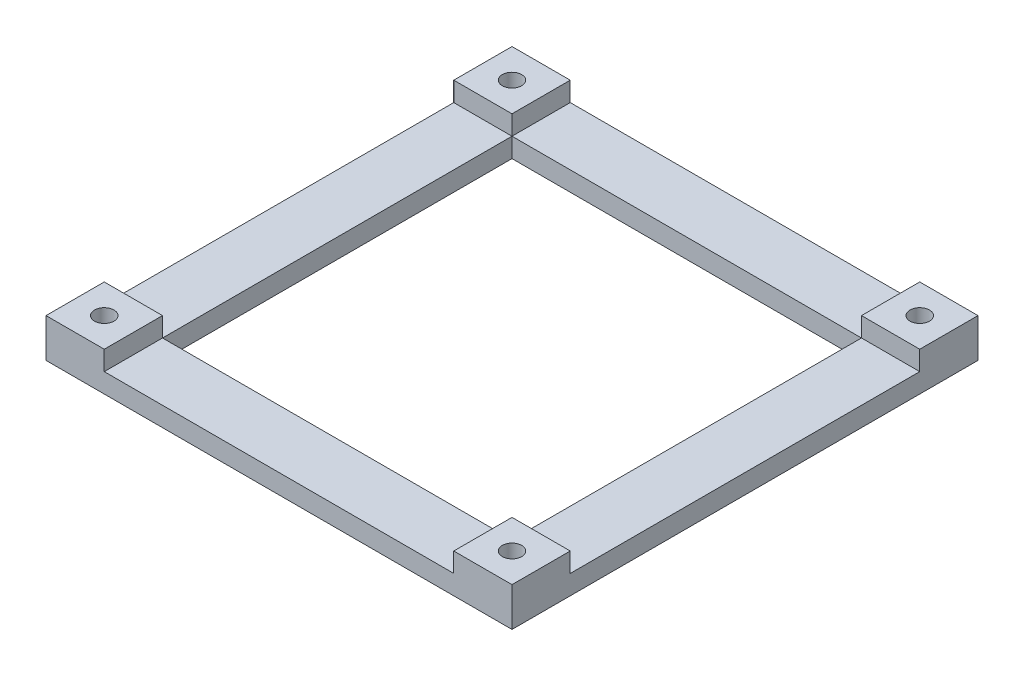
ISO-10303-21;
HEADER;
FILE_DESCRIPTION(('STEP AP214'),'2;1');
FILE_NAME('part.step','',(''),(''),'','','');
FILE_SCHEMA(('AUTOMOTIVE_DESIGN { 1 0 10303 214 1 1 1 1 }'));
ENDSEC;
DATA;
#1=APPLICATION_CONTEXT('core data for automotive mechanical design processes');
#2=APPLICATION_PROTOCOL_DEFINITION('international standard','automotive_design',2000,#1);
#3=PRODUCT_CONTEXT('',#1,'mechanical');
#4=PRODUCT('Part','Part','',(#3));
#5=PRODUCT_RELATED_PRODUCT_CATEGORY('part','',(#4));
#6=PRODUCT_DEFINITION_FORMATION('','',#4);
#7=PRODUCT_DEFINITION_CONTEXT('part definition',#1,'design');
#8=PRODUCT_DEFINITION('design','',#6,#7);
#9=PRODUCT_DEFINITION_SHAPE('','',#8);
#10=(LENGTH_UNIT() NAMED_UNIT(*) SI_UNIT(.MILLI.,.METRE.));
#11=(NAMED_UNIT(*) PLANE_ANGLE_UNIT() SI_UNIT($,.RADIAN.));
#12=(NAMED_UNIT(*) SI_UNIT($,.STERADIAN.) SOLID_ANGLE_UNIT());
#13=UNCERTAINTY_MEASURE_WITH_UNIT(LENGTH_MEASURE(1.E-05),#10,'distance_accuracy_value','');
#14=(GEOMETRIC_REPRESENTATION_CONTEXT(3) GLOBAL_UNCERTAINTY_ASSIGNED_CONTEXT((#13)) GLOBAL_UNIT_ASSIGNED_CONTEXT((#10,
#11,#12)) REPRESENTATION_CONTEXT('',''));
#15=CARTESIAN_POINT('',(0.,0.,0.));
#16=DIRECTION('',(0.,0.,1.));
#17=DIRECTION('',(1.,0.,0.));
#18=AXIS2_PLACEMENT_3D('',#15,#16,#17);
#19=CARTESIAN_POINT('',(0.,5.,0.));
#20=DIRECTION('',(0.,-1.,0.));
#21=DIRECTION('',(0.,0.,-1.));
#22=AXIS2_PLACEMENT_3D('',#19,#20,#21);
#23=PLANE('',#22);
#24=DIRECTION('',(-1.,0.,0.));
#25=VECTOR('',#24,1.);
#26=CARTESIAN_POINT('',(-45.,5.,45.));
#27=LINE('',#26,#25);
#28=CARTESIAN_POINT('',(-45.,5.,45.));
#29=VERTEX_POINT('',#28);
#30=CARTESIAN_POINT('',(-60.,5.,45.));
#31=VERTEX_POINT('',#30);
#32=EDGE_CURVE('E258',#29,#31,#27,.T.);
#33=ORIENTED_EDGE('',*,*,#32,.F.);
#34=DIRECTION('',(0.,0.,1.));
#35=VECTOR('',#34,1.);
#36=CARTESIAN_POINT('',(-45.,5.,45.));
#37=LINE('',#36,#35);
#38=CARTESIAN_POINT('',(-45.,5.,-45.));
#39=VERTEX_POINT('',#38);
#40=EDGE_CURVE('E348',#39,#29,#37,.T.);
#41=ORIENTED_EDGE('',*,*,#40,.F.);
#42=DIRECTION('',(1.,0.,0.));
#43=VECTOR('',#42,1.);
#44=CARTESIAN_POINT('',(-45.,5.,-45.));
#45=LINE('',#44,#43);
#46=CARTESIAN_POINT('',(-60.,5.,-45.));
#47=VERTEX_POINT('',#46);
#48=EDGE_CURVE('E323',#47,#39,#45,.T.);
#49=ORIENTED_EDGE('',*,*,#48,.F.);
#50=DIRECTION('',(0.,0.,1.));
#51=VECTOR('',#50,1.);
#52=CARTESIAN_POINT('',(-60.,5.,60.));
#53=LINE('',#52,#51);
#54=EDGE_CURVE('E382',#47,#31,#53,.T.);
#55=ORIENTED_EDGE('',*,*,#54,.T.);
#56=EDGE_LOOP('',(#33,#41,#49,#55));
#57=FACE_BOUND('',#56,.T.);
#58=ADVANCED_FACE('F50',(#57),#23,.F.);
#59=DIRECTION('',(0.,0.,-1.));
#60=VECTOR('',#59,1.);
#61=CARTESIAN_POINT('',(-45.,5.,45.));
#62=LINE('',#61,#60);
#63=CARTESIAN_POINT('',(-45.,5.,60.));
#64=VERTEX_POINT('',#63);
#65=EDGE_CURVE('E66',#64,#29,#62,.T.);
#66=ORIENTED_EDGE('',*,*,#65,.F.);
#67=DIRECTION('',(1.,0.,0.));
#68=VECTOR('',#67,1.);
#69=CARTESIAN_POINT('',(-60.,5.,60.));
#70=LINE('',#69,#68);
#71=CARTESIAN_POINT('',(45.,5.,60.));
#72=VERTEX_POINT('',#71);
#73=EDGE_CURVE('E64',#64,#72,#70,.T.);
#74=ORIENTED_EDGE('',*,*,#73,.T.);
#75=DIRECTION('',(0.,0.,1.));
#76=VECTOR('',#75,1.);
#77=CARTESIAN_POINT('',(45.,5.,45.));
#78=LINE('',#77,#76);
#79=CARTESIAN_POINT('',(45.,5.,45.));
#80=VERTEX_POINT('',#79);
#81=EDGE_CURVE('E267',#80,#72,#78,.T.);
#82=ORIENTED_EDGE('',*,*,#81,.F.);
#83=DIRECTION('',(1.,0.,0.));
#84=VECTOR('',#83,1.);
#85=CARTESIAN_POINT('',(-45.,5.,45.));
#86=LINE('',#85,#84);
#87=EDGE_CURVE('E200',#29,#80,#86,.T.);
#88=ORIENTED_EDGE('',*,*,#87,.F.);
#89=EDGE_LOOP('',(#66,#74,#82,#88));
#90=FACE_BOUND('',#89,.T.);
#91=ADVANCED_FACE('F433',(#90),#23,.F.);
#92=DIRECTION('',(-1.,0.,0.));
#93=VECTOR('',#92,1.);
#94=CARTESIAN_POINT('',(45.,5.,45.));
#95=LINE('',#94,#93);
#96=CARTESIAN_POINT('',(60.,5.,45.));
#97=VERTEX_POINT('',#96);
#98=EDGE_CURVE('E264',#97,#80,#95,.T.);
#99=ORIENTED_EDGE('',*,*,#98,.F.);
#100=DIRECTION('',(0.,0.,-1.));
#101=VECTOR('',#100,1.);
#102=CARTESIAN_POINT('',(60.,5.,60.));
#103=LINE('',#102,#101);
#104=CARTESIAN_POINT('',(60.,5.,-45.));
#105=VERTEX_POINT('',#104);
#106=EDGE_CURVE('E211',#97,#105,#103,.T.);
#107=ORIENTED_EDGE('',*,*,#106,.T.);
#108=DIRECTION('',(1.,0.,0.));
#109=VECTOR('',#108,1.);
#110=CARTESIAN_POINT('',(45.,5.,-45.));
#111=LINE('',#110,#109);
#112=CARTESIAN_POINT('',(45.,5.,-45.));
#113=VERTEX_POINT('',#112);
#114=EDGE_CURVE('E208',#113,#105,#111,.T.);
#115=ORIENTED_EDGE('',*,*,#114,.F.);
#116=DIRECTION('',(0.,0.,-1.));
#117=VECTOR('',#116,1.);
#118=CARTESIAN_POINT('',(45.,5.,45.));
#119=LINE('',#118,#117);
#120=EDGE_CURVE('E187',#80,#113,#119,.T.);
#121=ORIENTED_EDGE('',*,*,#120,.F.);
#122=EDGE_LOOP('',(#99,#107,#115,#121));
#123=FACE_BOUND('',#122,.T.);
#124=ADVANCED_FACE('F207',(#123),#23,.F.);
#125=DIRECTION('',(0.,0.,1.));
#126=VECTOR('',#125,1.);
#127=CARTESIAN_POINT('',(45.,5.,-45.));
#128=LINE('',#127,#126);
#129=CARTESIAN_POINT('',(45.,5.,-60.));
#130=VERTEX_POINT('',#129);
#131=EDGE_CURVE('E178',#130,#113,#128,.T.);
#132=ORIENTED_EDGE('',*,*,#131,.F.);
#133=DIRECTION('',(-1.,0.,0.));
#134=VECTOR('',#133,1.);
#135=CARTESIAN_POINT('',(-60.,5.,-60.));
#136=LINE('',#135,#134);
#137=CARTESIAN_POINT('',(-45.,5.,-60.));
#138=VERTEX_POINT('',#137);
#139=EDGE_CURVE('E377',#130,#138,#136,.T.);
#140=ORIENTED_EDGE('',*,*,#139,.T.);
#141=DIRECTION('',(0.,0.,-1.));
#142=VECTOR('',#141,1.);
#143=CARTESIAN_POINT('',(-45.,5.,-45.));
#144=LINE('',#143,#142);
#145=EDGE_CURVE('E177',#39,#138,#144,.T.);
#146=ORIENTED_EDGE('',*,*,#145,.F.);
#147=DIRECTION('',(-1.,0.,0.));
#148=VECTOR('',#147,1.);
#149=CARTESIAN_POINT('',(-45.,5.,-45.));
#150=LINE('',#149,#148);
#151=EDGE_CURVE('E175',#113,#39,#150,.T.);
#152=ORIENTED_EDGE('',*,*,#151,.F.);
#153=EDGE_LOOP('',(#132,#140,#146,#152));
#154=FACE_BOUND('',#153,.T.);
#155=ADVANCED_FACE('F171',(#154),#23,.F.);
#156=CARTESIAN_POINT('',(0.,0.,0.));
#157=DIRECTION('',(0.,-1.,0.));
#158=DIRECTION('',(0.,0.,-1.));
#159=AXIS2_PLACEMENT_3D('',#156,#157,#158);
#160=PLANE('',#159);
#161=CARTESIAN_POINT('',(52.4999999999995,0.,52.5000000000005));
#162=DIRECTION('',(0.,1.,0.));
#163=DIRECTION('',(0.,0.,1.));
#164=AXIS2_PLACEMENT_3D('',#161,#162,#163);
#165=CIRCLE('',#164,2.5);
#166=CARTESIAN_POINT('',(52.4999999999995,0.,55.0000000000005));
#167=VERTEX_POINT('',#166);
#168=EDGE_CURVE('E450',#167,#167,#165,.T.);
#169=ORIENTED_EDGE('',*,*,#168,.T.);
#170=EDGE_LOOP('',(#169));
#171=FACE_BOUND('',#170,.T.);
#172=CARTESIAN_POINT('',(52.5000000000004,0.,-52.4999999999996));
#173=DIRECTION('',(0.,1.,0.));
#174=DIRECTION('',(0.,0.,1.));
#175=AXIS2_PLACEMENT_3D('',#172,#173,#174);
#176=CIRCLE('',#175,2.5);
#177=CARTESIAN_POINT('',(52.5000000000004,0.,-49.9999999999996));
#178=VERTEX_POINT('',#177);
#179=EDGE_CURVE('E454',#178,#178,#176,.T.);
#180=ORIENTED_EDGE('',*,*,#179,.T.);
#181=EDGE_LOOP('',(#180));
#182=FACE_BOUND('',#181,.T.);
#183=CARTESIAN_POINT('',(-52.4999999999998,0.,-52.5000000000002));
#184=DIRECTION('',(0.,1.,0.));
#185=DIRECTION('',(0.,0.,1.));
#186=AXIS2_PLACEMENT_3D('',#183,#184,#185);
#187=CIRCLE('',#186,2.5);
#188=CARTESIAN_POINT('',(-52.4999999999998,0.,-50.0000000000002));
#189=VERTEX_POINT('',#188);
#190=EDGE_CURVE('E464',#189,#189,#187,.T.);
#191=ORIENTED_EDGE('',*,*,#190,.T.);
#192=EDGE_LOOP('',(#191));
#193=FACE_BOUND('',#192,.T.);
#194=CARTESIAN_POINT('',(-52.5,0.,52.5));
#195=DIRECTION('',(0.,1.,0.));
#196=DIRECTION('',(0.,0.,1.));
#197=AXIS2_PLACEMENT_3D('',#194,#195,#196);
#198=CIRCLE('',#197,2.5);
#199=CARTESIAN_POINT('',(-52.5,0.,55.));
#200=VERTEX_POINT('',#199);
#201=EDGE_CURVE('E292',#200,#200,#198,.T.);
#202=ORIENTED_EDGE('',*,*,#201,.T.);
#203=EDGE_LOOP('',(#202));
#204=FACE_BOUND('',#203,.T.);
#205=DIRECTION('',(0.,0.,-1.));
#206=VECTOR('',#205,1.);
#207=CARTESIAN_POINT('',(60.,0.,60.));
#208=LINE('',#207,#206);
#209=CARTESIAN_POINT('',(60.,0.,60.));
#210=VERTEX_POINT('',#209);
#211=CARTESIAN_POINT('',(60.,0.,-60.));
#212=VERTEX_POINT('',#211);
#213=EDGE_CURVE('E376',#210,#212,#208,.T.);
#214=ORIENTED_EDGE('',*,*,#213,.F.);
#215=DIRECTION('',(1.,0.,0.));
#216=VECTOR('',#215,1.);
#217=CARTESIAN_POINT('',(-60.,0.,60.));
#218=LINE('',#217,#216);
#219=CARTESIAN_POINT('',(-60.,0.,60.));
#220=VERTEX_POINT('',#219);
#221=EDGE_CURVE('E379',#220,#210,#218,.T.);
#222=ORIENTED_EDGE('',*,*,#221,.F.);
#223=DIRECTION('',(0.,0.,1.));
#224=VECTOR('',#223,1.);
#225=CARTESIAN_POINT('',(-60.,0.,60.));
#226=LINE('',#225,#224);
#227=CARTESIAN_POINT('',(-60.,0.,-60.));
#228=VERTEX_POINT('',#227);
#229=EDGE_CURVE('E391',#228,#220,#226,.T.);
#230=ORIENTED_EDGE('',*,*,#229,.F.);
#231=DIRECTION('',(-1.,0.,0.));
#232=VECTOR('',#231,1.);
#233=CARTESIAN_POINT('',(-60.,0.,-60.));
#234=LINE('',#233,#232);
#235=EDGE_CURVE('E392',#212,#228,#234,.T.);
#236=ORIENTED_EDGE('',*,*,#235,.F.);
#237=EDGE_LOOP('',(#214,#222,#230,#236));
#238=FACE_BOUND('',#237,.T.);
#239=DIRECTION('',(-1.,0.,0.));
#240=VECTOR('',#239,1.);
#241=CARTESIAN_POINT('',(-45.,0.,-45.));
#242=LINE('',#241,#240);
#243=CARTESIAN_POINT('',(45.,0.,-45.));
#244=VERTEX_POINT('',#243);
#245=CARTESIAN_POINT('',(-45.,0.,-45.));
#246=VERTEX_POINT('',#245);
#247=EDGE_CURVE('E201',#244,#246,#242,.T.);
#248=ORIENTED_EDGE('',*,*,#247,.T.);
#249=DIRECTION('',(0.,0.,1.));
#250=VECTOR('',#249,1.);
#251=CARTESIAN_POINT('',(-45.,0.,45.));
#252=LINE('',#251,#250);
#253=CARTESIAN_POINT('',(-45.,0.,45.));
#254=VERTEX_POINT('',#253);
#255=EDGE_CURVE('E349',#246,#254,#252,.T.);
#256=ORIENTED_EDGE('',*,*,#255,.T.);
#257=DIRECTION('',(1.,0.,0.));
#258=VECTOR('',#257,1.);
#259=CARTESIAN_POINT('',(-45.,0.,45.));
#260=LINE('',#259,#258);
#261=CARTESIAN_POINT('',(45.,0.,45.));
#262=VERTEX_POINT('',#261);
#263=EDGE_CURVE('E356',#254,#262,#260,.T.);
#264=ORIENTED_EDGE('',*,*,#263,.T.);
#265=DIRECTION('',(0.,0.,-1.));
#266=VECTOR('',#265,1.);
#267=CARTESIAN_POINT('',(45.,0.,45.));
#268=LINE('',#267,#266);
#269=EDGE_CURVE('E361',#262,#244,#268,.T.);
#270=ORIENTED_EDGE('',*,*,#269,.T.);
#271=EDGE_LOOP('',(#248,#256,#264,#270));
#272=FACE_BOUND('',#271,.T.);
#273=ADVANCED_FACE('F418',(#171,#182,#193,#204,#238,#272),#160,.T.);
#274=CARTESIAN_POINT('',(60.,5.,60.));
#275=DIRECTION('',(-1.,0.,0.));
#276=DIRECTION('',(0.,0.,1.));
#277=AXIS2_PLACEMENT_3D('',#274,#275,#276);
#278=PLANE('',#277);
#279=ORIENTED_EDGE('',*,*,#213,.T.);
#280=DIRECTION('',(0.,-1.,0.));
#281=VECTOR('',#280,1.);
#282=CARTESIAN_POINT('',(60.,5.,-60.));
#283=LINE('',#282,#281);
#284=CARTESIAN_POINT('',(60.,10.,-60.));
#285=VERTEX_POINT('',#284);
#286=EDGE_CURVE('E11',#285,#212,#283,.T.);
#287=ORIENTED_EDGE('',*,*,#286,.F.);
#288=DIRECTION('',(0.,0.,-1.));
#289=VECTOR('',#288,1.);
#290=CARTESIAN_POINT('',(60.,10.,-45.));
#291=LINE('',#290,#289);
#292=CARTESIAN_POINT('',(60.,10.,-45.));
#293=VERTEX_POINT('',#292);
#294=EDGE_CURVE('E247',#293,#285,#291,.T.);
#295=ORIENTED_EDGE('',*,*,#294,.F.);
#296=DIRECTION('',(0.,-1.,0.));
#297=VECTOR('',#296,1.);
#298=CARTESIAN_POINT('',(60.,10.,-45.));
#299=LINE('',#298,#297);
#300=EDGE_CURVE('E238',#293,#105,#299,.T.);
#301=ORIENTED_EDGE('',*,*,#300,.T.);
#302=ORIENTED_EDGE('',*,*,#106,.F.);
#303=DIRECTION('',(0.,-1.,0.));
#304=VECTOR('',#303,1.);
#305=CARTESIAN_POINT('',(60.,10.,45.));
#306=LINE('',#305,#304);
#307=CARTESIAN_POINT('',(60.,10.,45.));
#308=VERTEX_POINT('',#307);
#309=EDGE_CURVE('E254',#308,#97,#306,.T.);
#310=ORIENTED_EDGE('',*,*,#309,.F.);
#311=DIRECTION('',(0.,0.,-1.));
#312=VECTOR('',#311,1.);
#313=CARTESIAN_POINT('',(60.,10.,45.));
#314=LINE('',#313,#312);
#315=CARTESIAN_POINT('',(60.,10.,60.));
#316=VERTEX_POINT('',#315);
#317=EDGE_CURVE('E277',#316,#308,#314,.T.);
#318=ORIENTED_EDGE('',*,*,#317,.F.);
#319=DIRECTION('',(0.,-1.,0.));
#320=VECTOR('',#319,1.);
#321=CARTESIAN_POINT('',(60.,5.,60.));
#322=LINE('',#321,#320);
#323=EDGE_CURVE('E390',#316,#210,#322,.T.);
#324=ORIENTED_EDGE('',*,*,#323,.T.);
#325=EDGE_LOOP('',(#279,#287,#295,#301,#302,#310,#318,#324));
#326=FACE_BOUND('',#325,.T.);
#327=ADVANCED_FACE('F47',(#326),#278,.F.);
#328=CARTESIAN_POINT('',(-60.,5.,-60.));
#329=DIRECTION('',(0.,0.,1.));
#330=DIRECTION('',(1.,0.,0.));
#331=AXIS2_PLACEMENT_3D('',#328,#329,#330);
#332=PLANE('',#331);
#333=ORIENTED_EDGE('',*,*,#235,.T.);
#334=DIRECTION('',(0.,-1.,0.));
#335=VECTOR('',#334,1.);
#336=CARTESIAN_POINT('',(-60.,5.,-60.));
#337=LINE('',#336,#335);
#338=CARTESIAN_POINT('',(-60.,10.,-60.));
#339=VERTEX_POINT('',#338);
#340=EDGE_CURVE('E57',#339,#228,#337,.T.);
#341=ORIENTED_EDGE('',*,*,#340,.F.);
#342=DIRECTION('',(-1.,0.,0.));
#343=VECTOR('',#342,1.);
#344=CARTESIAN_POINT('',(-45.,10.,-60.));
#345=LINE('',#344,#343);
#346=CARTESIAN_POINT('',(-45.,10.,-60.));
#347=VERTEX_POINT('',#346);
#348=EDGE_CURVE('E325',#347,#339,#345,.T.);
#349=ORIENTED_EDGE('',*,*,#348,.F.);
#350=DIRECTION('',(0.,-1.,0.));
#351=VECTOR('',#350,1.);
#352=CARTESIAN_POINT('',(-45.,10.,-60.));
#353=LINE('',#352,#351);
#354=EDGE_CURVE('E344',#347,#138,#353,.T.);
#355=ORIENTED_EDGE('',*,*,#354,.T.);
#356=ORIENTED_EDGE('',*,*,#139,.F.);
#357=DIRECTION('',(0.,-1.,0.));
#358=VECTOR('',#357,1.);
#359=CARTESIAN_POINT('',(45.,10.,-60.));
#360=LINE('',#359,#358);
#361=CARTESIAN_POINT('',(45.,10.,-60.));
#362=VERTEX_POINT('',#361);
#363=EDGE_CURVE('E227',#362,#130,#360,.T.);
#364=ORIENTED_EDGE('',*,*,#363,.F.);
#365=DIRECTION('',(-1.,0.,0.));
#366=VECTOR('',#365,1.);
#367=CARTESIAN_POINT('',(45.,10.,-60.));
#368=LINE('',#367,#366);
#369=EDGE_CURVE('E240',#285,#362,#368,.T.);
#370=ORIENTED_EDGE('',*,*,#369,.F.);
#371=ORIENTED_EDGE('',*,*,#286,.T.);
#372=EDGE_LOOP('',(#333,#341,#349,#355,#356,#364,#370,#371));
#373=FACE_BOUND('',#372,.T.);
#374=ADVANCED_FACE('F482',(#373),#332,.F.);
#375=CARTESIAN_POINT('',(-60.,5.,60.));
#376=DIRECTION('',(1.,0.,0.));
#377=DIRECTION('',(0.,0.,-1.));
#378=AXIS2_PLACEMENT_3D('',#375,#376,#377);
#379=PLANE('',#378);
#380=ORIENTED_EDGE('',*,*,#229,.T.);
#381=DIRECTION('',(0.,-1.,0.));
#382=VECTOR('',#381,1.);
#383=CARTESIAN_POINT('',(-60.,5.,60.));
#384=LINE('',#383,#382);
#385=CARTESIAN_POINT('',(-60.,10.,60.));
#386=VERTEX_POINT('',#385);
#387=EDGE_CURVE('E405',#386,#220,#384,.T.);
#388=ORIENTED_EDGE('',*,*,#387,.F.);
#389=DIRECTION('',(0.,0.,1.));
#390=VECTOR('',#389,1.);
#391=CARTESIAN_POINT('',(-60.,10.,45.));
#392=LINE('',#391,#390);
#393=CARTESIAN_POINT('',(-60.,10.,45.));
#394=VERTEX_POINT('',#393);
#395=EDGE_CURVE('E313',#394,#386,#392,.T.);
#396=ORIENTED_EDGE('',*,*,#395,.F.);
#397=DIRECTION('',(0.,-1.,0.));
#398=VECTOR('',#397,1.);
#399=CARTESIAN_POINT('',(-60.,10.,45.));
#400=LINE('',#399,#398);
#401=EDGE_CURVE('E288',#394,#31,#400,.T.);
#402=ORIENTED_EDGE('',*,*,#401,.T.);
#403=ORIENTED_EDGE('',*,*,#54,.F.);
#404=DIRECTION('',(0.,-1.,0.));
#405=VECTOR('',#404,1.);
#406=CARTESIAN_POINT('',(-60.,10.,-45.));
#407=LINE('',#406,#405);
#408=CARTESIAN_POINT('',(-60.,10.,-45.));
#409=VERTEX_POINT('',#408);
#410=EDGE_CURVE('E343',#409,#47,#407,.T.);
#411=ORIENTED_EDGE('',*,*,#410,.F.);
#412=DIRECTION('',(0.,0.,1.));
#413=VECTOR('',#412,1.);
#414=CARTESIAN_POINT('',(-60.,10.,-45.));
#415=LINE('',#414,#413);
#416=EDGE_CURVE('E330',#339,#409,#415,.T.);
#417=ORIENTED_EDGE('',*,*,#416,.F.);
#418=ORIENTED_EDGE('',*,*,#340,.T.);
#419=EDGE_LOOP('',(#380,#388,#396,#402,#403,#411,#417,#418));
#420=FACE_BOUND('',#419,.T.);
#421=ADVANCED_FACE('F408',(#420),#379,.F.);
#422=CARTESIAN_POINT('',(-60.,5.,60.));
#423=DIRECTION('',(0.,0.,-1.));
#424=DIRECTION('',(-1.,0.,0.));
#425=AXIS2_PLACEMENT_3D('',#422,#423,#424);
#426=PLANE('',#425);
#427=ORIENTED_EDGE('',*,*,#221,.T.);
#428=ORIENTED_EDGE('',*,*,#323,.F.);
#429=DIRECTION('',(1.,0.,0.));
#430=VECTOR('',#429,1.);
#431=CARTESIAN_POINT('',(45.,10.,60.));
#432=LINE('',#431,#430);
#433=CARTESIAN_POINT('',(45.,10.,60.));
#434=VERTEX_POINT('',#433);
#435=EDGE_CURVE('E276',#434,#316,#432,.T.);
#436=ORIENTED_EDGE('',*,*,#435,.F.);
#437=DIRECTION('',(0.,-1.,0.));
#438=VECTOR('',#437,1.);
#439=CARTESIAN_POINT('',(45.,10.,60.));
#440=LINE('',#439,#438);
#441=EDGE_CURVE('E252',#434,#72,#440,.T.);
#442=ORIENTED_EDGE('',*,*,#441,.T.);
#443=ORIENTED_EDGE('',*,*,#73,.F.);
#444=DIRECTION('',(0.,-1.,0.));
#445=VECTOR('',#444,1.);
#446=CARTESIAN_POINT('',(-45.,10.,60.));
#447=LINE('',#446,#445);
#448=CARTESIAN_POINT('',(-45.,10.,60.));
#449=VERTEX_POINT('',#448);
#450=EDGE_CURVE('E289',#449,#64,#447,.T.);
#451=ORIENTED_EDGE('',*,*,#450,.F.);
#452=DIRECTION('',(1.,0.,0.));
#453=VECTOR('',#452,1.);
#454=CARTESIAN_POINT('',(-45.,10.,60.));
#455=LINE('',#454,#453);
#456=EDGE_CURVE('E306',#386,#449,#455,.T.);
#457=ORIENTED_EDGE('',*,*,#456,.F.);
#458=ORIENTED_EDGE('',*,*,#387,.T.);
#459=EDGE_LOOP('',(#427,#428,#436,#442,#443,#451,#457,#458));
#460=FACE_BOUND('',#459,.T.);
#461=ADVANCED_FACE('F420',(#460),#426,.F.);
#462=CARTESIAN_POINT('',(-45.,5.,45.));
#463=DIRECTION('',(1.,0.,0.));
#464=DIRECTION('',(0.,0.,-1.));
#465=AXIS2_PLACEMENT_3D('',#462,#463,#464);
#466=PLANE('',#465);
#467=ORIENTED_EDGE('',*,*,#255,.F.);
#468=DIRECTION('',(0.,-1.,0.));
#469=VECTOR('',#468,1.);
#470=CARTESIAN_POINT('',(-45.,5.,-45.));
#471=LINE('',#470,#469);
#472=EDGE_CURVE('E183',#39,#246,#471,.T.);
#473=ORIENTED_EDGE('',*,*,#472,.F.);
#474=ORIENTED_EDGE('',*,*,#40,.T.);
#475=DIRECTION('',(0.,-1.,0.));
#476=VECTOR('',#475,1.);
#477=CARTESIAN_POINT('',(-45.,5.,45.));
#478=LINE('',#477,#476);
#479=EDGE_CURVE('E375',#29,#254,#478,.T.);
#480=ORIENTED_EDGE('',*,*,#479,.T.);
#481=EDGE_LOOP('',(#467,#473,#474,#480));
#482=FACE_BOUND('',#481,.T.);
#483=ADVANCED_FACE('F549',(#482),#466,.T.);
#484=CARTESIAN_POINT('',(-45.,5.,45.));
#485=DIRECTION('',(0.,0.,-1.));
#486=DIRECTION('',(-1.,0.,0.));
#487=AXIS2_PLACEMENT_3D('',#484,#485,#486);
#488=PLANE('',#487);
#489=ORIENTED_EDGE('',*,*,#263,.F.);
#490=ORIENTED_EDGE('',*,*,#479,.F.);
#491=ORIENTED_EDGE('',*,*,#87,.T.);
#492=DIRECTION('',(0.,-1.,0.));
#493=VECTOR('',#492,1.);
#494=CARTESIAN_POINT('',(45.,5.,45.));
#495=LINE('',#494,#493);
#496=EDGE_CURVE('E191',#80,#262,#495,.T.);
#497=ORIENTED_EDGE('',*,*,#496,.T.);
#498=EDGE_LOOP('',(#489,#490,#491,#497));
#499=FACE_BOUND('',#498,.T.);
#500=ADVANCED_FACE('F541',(#499),#488,.T.);
#501=CARTESIAN_POINT('',(45.,5.,45.));
#502=DIRECTION('',(-1.,0.,0.));
#503=DIRECTION('',(0.,0.,1.));
#504=AXIS2_PLACEMENT_3D('',#501,#502,#503);
#505=PLANE('',#504);
#506=ORIENTED_EDGE('',*,*,#269,.F.);
#507=ORIENTED_EDGE('',*,*,#496,.F.);
#508=ORIENTED_EDGE('',*,*,#120,.T.);
#509=DIRECTION('',(0.,-1.,0.));
#510=VECTOR('',#509,1.);
#511=CARTESIAN_POINT('',(45.,5.,-45.));
#512=LINE('',#511,#510);
#513=EDGE_CURVE('E194',#113,#244,#512,.T.);
#514=ORIENTED_EDGE('',*,*,#513,.T.);
#515=EDGE_LOOP('',(#506,#507,#508,#514));
#516=FACE_BOUND('',#515,.T.);
#517=ADVANCED_FACE('F192',(#516),#505,.T.);
#518=CARTESIAN_POINT('',(-45.,5.,-45.));
#519=DIRECTION('',(0.,0.,1.));
#520=DIRECTION('',(1.,0.,0.));
#521=AXIS2_PLACEMENT_3D('',#518,#519,#520);
#522=PLANE('',#521);
#523=ORIENTED_EDGE('',*,*,#247,.F.);
#524=ORIENTED_EDGE('',*,*,#513,.F.);
#525=ORIENTED_EDGE('',*,*,#151,.T.);
#526=ORIENTED_EDGE('',*,*,#472,.T.);
#527=EDGE_LOOP('',(#523,#524,#525,#526));
#528=FACE_BOUND('',#527,.T.);
#529=ADVANCED_FACE('F203',(#528),#522,.T.);
#530=CARTESIAN_POINT('',(-45.,10.,-45.));
#531=DIRECTION('',(-1.,0.,0.));
#532=DIRECTION('',(0.,0.,1.));
#533=AXIS2_PLACEMENT_3D('',#530,#531,#532);
#534=PLANE('',#533);
#535=ORIENTED_EDGE('',*,*,#145,.T.);
#536=ORIENTED_EDGE('',*,*,#354,.F.);
#537=DIRECTION('',(0.,0.,-1.));
#538=VECTOR('',#537,1.);
#539=CARTESIAN_POINT('',(-45.,10.,-45.));
#540=LINE('',#539,#538);
#541=CARTESIAN_POINT('',(-45.,10.,-45.));
#542=VERTEX_POINT('',#541);
#543=EDGE_CURVE('E318',#542,#347,#540,.T.);
#544=ORIENTED_EDGE('',*,*,#543,.F.);
#545=DIRECTION('',(0.,-1.,0.));
#546=VECTOR('',#545,1.);
#547=CARTESIAN_POINT('',(-45.,10.,-45.));
#548=LINE('',#547,#546);
#549=EDGE_CURVE('E334',#542,#39,#548,.T.);
#550=ORIENTED_EDGE('',*,*,#549,.T.);
#551=EDGE_LOOP('',(#535,#536,#544,#550));
#552=FACE_BOUND('',#551,.T.);
#553=ADVANCED_FACE('F483',(#552),#534,.F.);
#554=CARTESIAN_POINT('',(-45.,10.,-45.));
#555=DIRECTION('',(0.,0.,-1.));
#556=DIRECTION('',(-1.,0.,0.));
#557=AXIS2_PLACEMENT_3D('',#554,#555,#556);
#558=PLANE('',#557);
#559=ORIENTED_EDGE('',*,*,#48,.T.);
#560=ORIENTED_EDGE('',*,*,#549,.F.);
#561=DIRECTION('',(1.,0.,0.));
#562=VECTOR('',#561,1.);
#563=CARTESIAN_POINT('',(-45.,10.,-45.));
#564=LINE('',#563,#562);
#565=EDGE_CURVE('E329',#409,#542,#564,.T.);
#566=ORIENTED_EDGE('',*,*,#565,.F.);
#567=ORIENTED_EDGE('',*,*,#410,.T.);
#568=EDGE_LOOP('',(#559,#560,#566,#567));
#569=FACE_BOUND('',#568,.T.);
#570=ADVANCED_FACE('F478',(#569),#558,.F.);
#571=CARTESIAN_POINT('',(0.,10.,0.));
#572=DIRECTION('',(0.,1.,0.));
#573=DIRECTION('',(0.,0.,1.));
#574=AXIS2_PLACEMENT_3D('',#571,#572,#573);
#575=PLANE('',#574);
#576=CARTESIAN_POINT('',(-52.4999999999998,10.,-52.5000000000002));
#577=DIRECTION('',(0.,1.,0.));
#578=DIRECTION('',(0.,0.,1.));
#579=AXIS2_PLACEMENT_3D('',#576,#577,#578);
#580=CIRCLE('',#579,2.5);
#581=CARTESIAN_POINT('',(-52.4999999999998,10.,-50.0000000000002));
#582=VERTEX_POINT('',#581);
#583=EDGE_CURVE('E444',#582,#582,#580,.T.);
#584=ORIENTED_EDGE('',*,*,#583,.F.);
#585=EDGE_LOOP('',(#584));
#586=FACE_BOUND('',#585,.T.);
#587=ORIENTED_EDGE('',*,*,#543,.T.);
#588=ORIENTED_EDGE('',*,*,#348,.T.);
#589=ORIENTED_EDGE('',*,*,#416,.T.);
#590=ORIENTED_EDGE('',*,*,#565,.T.);
#591=EDGE_LOOP('',(#587,#588,#589,#590));
#592=FACE_BOUND('',#591,.T.);
#593=ADVANCED_FACE('F471',(#586,#592),#575,.T.);
#594=CARTESIAN_POINT('',(45.,10.,-45.));
#595=DIRECTION('',(0.,0.,-1.));
#596=DIRECTION('',(-1.,0.,0.));
#597=AXIS2_PLACEMENT_3D('',#594,#595,#596);
#598=PLANE('',#597);
#599=ORIENTED_EDGE('',*,*,#114,.T.);
#600=ORIENTED_EDGE('',*,*,#300,.F.);
#601=DIRECTION('',(1.,0.,0.));
#602=VECTOR('',#601,1.);
#603=CARTESIAN_POINT('',(45.,10.,-45.));
#604=LINE('',#603,#602);
#605=CARTESIAN_POINT('',(45.,10.,-45.));
#606=VERTEX_POINT('',#605);
#607=EDGE_CURVE('E229',#606,#293,#604,.T.);
#608=ORIENTED_EDGE('',*,*,#607,.F.);
#609=DIRECTION('',(0.,-1.,0.));
#610=VECTOR('',#609,1.);
#611=CARTESIAN_POINT('',(45.,10.,-45.));
#612=LINE('',#611,#610);
#613=EDGE_CURVE('E224',#606,#113,#612,.T.);
#614=ORIENTED_EDGE('',*,*,#613,.T.);
#615=EDGE_LOOP('',(#599,#600,#608,#614));
#616=FACE_BOUND('',#615,.T.);
#617=ADVANCED_FACE('F228',(#616),#598,.F.);
#618=CARTESIAN_POINT('',(45.,10.,-45.));
#619=DIRECTION('',(1.,0.,0.));
#620=DIRECTION('',(0.,0.,-1.));
#621=AXIS2_PLACEMENT_3D('',#618,#619,#620);
#622=PLANE('',#621);
#623=ORIENTED_EDGE('',*,*,#131,.T.);
#624=ORIENTED_EDGE('',*,*,#613,.F.);
#625=DIRECTION('',(0.,0.,1.));
#626=VECTOR('',#625,1.);
#627=CARTESIAN_POINT('',(45.,10.,-45.));
#628=LINE('',#627,#626);
#629=EDGE_CURVE('E231',#362,#606,#628,.T.);
#630=ORIENTED_EDGE('',*,*,#629,.F.);
#631=ORIENTED_EDGE('',*,*,#363,.T.);
#632=EDGE_LOOP('',(#623,#624,#630,#631));
#633=FACE_BOUND('',#632,.T.);
#634=ADVANCED_FACE('F222',(#633),#622,.F.);
#635=CARTESIAN_POINT('',(0.,10.,0.));
#636=DIRECTION('',(0.,1.,0.));
#637=DIRECTION('',(0.,0.,1.));
#638=AXIS2_PLACEMENT_3D('',#635,#636,#637);
#639=PLANE('',#638);
#640=CARTESIAN_POINT('',(52.5000000000004,10.,-52.4999999999996));
#641=DIRECTION('',(0.,1.,0.));
#642=DIRECTION('',(0.,0.,1.));
#643=AXIS2_PLACEMENT_3D('',#640,#641,#642);
#644=CIRCLE('',#643,2.5);
#645=CARTESIAN_POINT('',(52.5000000000004,10.,-49.9999999999996));
#646=VERTEX_POINT('',#645);
#647=EDGE_CURVE('E459',#646,#646,#644,.T.);
#648=ORIENTED_EDGE('',*,*,#647,.F.);
#649=EDGE_LOOP('',(#648));
#650=FACE_BOUND('',#649,.T.);
#651=ORIENTED_EDGE('',*,*,#607,.T.);
#652=ORIENTED_EDGE('',*,*,#294,.T.);
#653=ORIENTED_EDGE('',*,*,#369,.T.);
#654=ORIENTED_EDGE('',*,*,#629,.T.);
#655=EDGE_LOOP('',(#651,#652,#653,#654));
#656=FACE_BOUND('',#655,.T.);
#657=ADVANCED_FACE('F490',(#650,#656),#639,.T.);
#658=CARTESIAN_POINT('',(45.,10.,45.));
#659=DIRECTION('',(1.,0.,0.));
#660=DIRECTION('',(0.,0.,-1.));
#661=AXIS2_PLACEMENT_3D('',#658,#659,#660);
#662=PLANE('',#661);
#663=ORIENTED_EDGE('',*,*,#81,.T.);
#664=ORIENTED_EDGE('',*,*,#441,.F.);
#665=DIRECTION('',(0.,0.,1.));
#666=VECTOR('',#665,1.);
#667=CARTESIAN_POINT('',(45.,10.,45.));
#668=LINE('',#667,#666);
#669=CARTESIAN_POINT('',(45.,10.,45.));
#670=VERTEX_POINT('',#669);
#671=EDGE_CURVE('E269',#670,#434,#668,.T.);
#672=ORIENTED_EDGE('',*,*,#671,.F.);
#673=DIRECTION('',(0.,-1.,0.));
#674=VECTOR('',#673,1.);
#675=CARTESIAN_POINT('',(45.,10.,45.));
#676=LINE('',#675,#674);
#677=EDGE_CURVE('E257',#670,#80,#676,.T.);
#678=ORIENTED_EDGE('',*,*,#677,.T.);
#679=EDGE_LOOP('',(#663,#664,#672,#678));
#680=FACE_BOUND('',#679,.T.);
#681=ADVANCED_FACE('F435',(#680),#662,.F.);
#682=CARTESIAN_POINT('',(45.,10.,45.));
#683=DIRECTION('',(0.,0.,1.));
#684=DIRECTION('',(1.,0.,0.));
#685=AXIS2_PLACEMENT_3D('',#682,#683,#684);
#686=PLANE('',#685);
#687=ORIENTED_EDGE('',*,*,#98,.T.);
#688=ORIENTED_EDGE('',*,*,#677,.F.);
#689=DIRECTION('',(-1.,0.,0.));
#690=VECTOR('',#689,1.);
#691=CARTESIAN_POINT('',(45.,10.,45.));
#692=LINE('',#691,#690);
#693=EDGE_CURVE('E262',#308,#670,#692,.T.);
#694=ORIENTED_EDGE('',*,*,#693,.F.);
#695=ORIENTED_EDGE('',*,*,#309,.T.);
#696=EDGE_LOOP('',(#687,#688,#694,#695));
#697=FACE_BOUND('',#696,.T.);
#698=ADVANCED_FACE('F436',(#697),#686,.F.);
#699=CARTESIAN_POINT('',(0.,10.,0.));
#700=DIRECTION('',(0.,1.,0.));
#701=DIRECTION('',(0.,0.,1.));
#702=AXIS2_PLACEMENT_3D('',#699,#700,#701);
#703=PLANE('',#702);
#704=CARTESIAN_POINT('',(52.4999999999995,10.,52.5000000000005));
#705=DIRECTION('',(0.,1.,0.));
#706=DIRECTION('',(0.,0.,1.));
#707=AXIS2_PLACEMENT_3D('',#704,#705,#706);
#708=CIRCLE('',#707,2.5);
#709=CARTESIAN_POINT('',(52.4999999999995,10.,55.0000000000005));
#710=VERTEX_POINT('',#709);
#711=EDGE_CURVE('E453',#710,#710,#708,.T.);
#712=ORIENTED_EDGE('',*,*,#711,.F.);
#713=EDGE_LOOP('',(#712));
#714=FACE_BOUND('',#713,.T.);
#715=ORIENTED_EDGE('',*,*,#671,.T.);
#716=ORIENTED_EDGE('',*,*,#435,.T.);
#717=ORIENTED_EDGE('',*,*,#317,.T.);
#718=ORIENTED_EDGE('',*,*,#693,.T.);
#719=EDGE_LOOP('',(#715,#716,#717,#718));
#720=FACE_BOUND('',#719,.T.);
#721=ADVANCED_FACE('F426',(#714,#720),#703,.T.);
#722=CARTESIAN_POINT('',(-45.,10.,45.));
#723=DIRECTION('',(0.,0.,1.));
#724=DIRECTION('',(1.,0.,0.));
#725=AXIS2_PLACEMENT_3D('',#722,#723,#724);
#726=PLANE('',#725);
#727=ORIENTED_EDGE('',*,*,#32,.T.);
#728=ORIENTED_EDGE('',*,*,#401,.F.);
#729=DIRECTION('',(-1.,0.,0.));
#730=VECTOR('',#729,1.);
#731=CARTESIAN_POINT('',(-45.,10.,45.));
#732=LINE('',#731,#730);
#733=CARTESIAN_POINT('',(-45.,10.,45.));
#734=VERTEX_POINT('',#733);
#735=EDGE_CURVE('E304',#734,#394,#732,.T.);
#736=ORIENTED_EDGE('',*,*,#735,.F.);
#737=DIRECTION('',(0.,-1.,0.));
#738=VECTOR('',#737,1.);
#739=CARTESIAN_POINT('',(-45.,10.,45.));
#740=LINE('',#739,#738);
#741=EDGE_CURVE('E293',#734,#29,#740,.T.);
#742=ORIENTED_EDGE('',*,*,#741,.T.);
#743=EDGE_LOOP('',(#727,#728,#736,#742));
#744=FACE_BOUND('',#743,.T.);
#745=ADVANCED_FACE('F616',(#744),#726,.F.);
#746=CARTESIAN_POINT('',(-45.,10.,45.));
#747=DIRECTION('',(-1.,0.,0.));
#748=DIRECTION('',(0.,0.,1.));
#749=AXIS2_PLACEMENT_3D('',#746,#747,#748);
#750=PLANE('',#749);
#751=ORIENTED_EDGE('',*,*,#65,.T.);
#752=ORIENTED_EDGE('',*,*,#741,.F.);
#753=DIRECTION('',(0.,0.,-1.));
#754=VECTOR('',#753,1.);
#755=CARTESIAN_POINT('',(-45.,10.,45.));
#756=LINE('',#755,#754);
#757=EDGE_CURVE('E296',#449,#734,#756,.T.);
#758=ORIENTED_EDGE('',*,*,#757,.F.);
#759=ORIENTED_EDGE('',*,*,#450,.T.);
#760=EDGE_LOOP('',(#751,#752,#758,#759));
#761=FACE_BOUND('',#760,.T.);
#762=ADVANCED_FACE('F595',(#761),#750,.F.);
#763=CARTESIAN_POINT('',(0.,10.,0.));
#764=DIRECTION('',(0.,1.,0.));
#765=DIRECTION('',(0.,0.,1.));
#766=AXIS2_PLACEMENT_3D('',#763,#764,#765);
#767=PLANE('',#766);
#768=CARTESIAN_POINT('',(-52.5,10.,52.5));
#769=DIRECTION('',(0.,1.,0.));
#770=DIRECTION('',(0.,0.,1.));
#771=AXIS2_PLACEMENT_3D('',#768,#769,#770);
#772=CIRCLE('',#771,2.5);
#773=CARTESIAN_POINT('',(-52.5,10.,55.));
#774=VERTEX_POINT('',#773);
#775=EDGE_CURVE('E438',#774,#774,#772,.T.);
#776=ORIENTED_EDGE('',*,*,#775,.F.);
#777=EDGE_LOOP('',(#776));
#778=FACE_BOUND('',#777,.T.);
#779=ORIENTED_EDGE('',*,*,#735,.T.);
#780=ORIENTED_EDGE('',*,*,#395,.T.);
#781=ORIENTED_EDGE('',*,*,#456,.T.);
#782=ORIENTED_EDGE('',*,*,#757,.T.);
#783=EDGE_LOOP('',(#779,#780,#781,#782));
#784=FACE_BOUND('',#783,.T.);
#785=ADVANCED_FACE('F629',(#778,#784),#767,.T.);
#786=CARTESIAN_POINT('',(-52.5,0.,52.5));
#787=DIRECTION('',(0.,1.,0.));
#788=DIRECTION('',(0.,0.,1.));
#789=AXIS2_PLACEMENT_3D('',#786,#787,#788);
#790=CYLINDRICAL_SURFACE('',#789,2.5);
#791=ORIENTED_EDGE('',*,*,#201,.F.);
#792=EDGE_LOOP('',(#791));
#793=FACE_BOUND('',#792,.T.);
#794=ORIENTED_EDGE('',*,*,#775,.T.);
#795=EDGE_LOOP('',(#794));
#796=FACE_BOUND('',#795,.T.);
#797=ADVANCED_FACE('F635',(#793,#796),#790,.F.);
#798=CARTESIAN_POINT('',(52.4999999999995,0.,52.5000000000005));
#799=DIRECTION('',(0.,1.,0.));
#800=DIRECTION('',(0.,0.,1.));
#801=AXIS2_PLACEMENT_3D('',#798,#799,#800);
#802=CYLINDRICAL_SURFACE('',#801,2.5);
#803=ORIENTED_EDGE('',*,*,#168,.F.);
#804=EDGE_LOOP('',(#803));
#805=FACE_BOUND('',#804,.T.);
#806=ORIENTED_EDGE('',*,*,#711,.T.);
#807=EDGE_LOOP('',(#806));
#808=FACE_BOUND('',#807,.T.);
#809=ADVANCED_FACE('F641',(#805,#808),#802,.F.);
#810=CARTESIAN_POINT('',(52.5000000000004,0.,-52.4999999999996));
#811=DIRECTION('',(0.,1.,0.));
#812=DIRECTION('',(0.,0.,1.));
#813=AXIS2_PLACEMENT_3D('',#810,#811,#812);
#814=CYLINDRICAL_SURFACE('',#813,2.5);
#815=ORIENTED_EDGE('',*,*,#179,.F.);
#816=EDGE_LOOP('',(#815));
#817=FACE_BOUND('',#816,.T.);
#818=ORIENTED_EDGE('',*,*,#647,.T.);
#819=EDGE_LOOP('',(#818));
#820=FACE_BOUND('',#819,.T.);
#821=ADVANCED_FACE('F653',(#817,#820),#814,.F.);
#822=CARTESIAN_POINT('',(-52.4999999999998,0.,-52.5000000000002));
#823=DIRECTION('',(0.,1.,0.));
#824=DIRECTION('',(0.,0.,1.));
#825=AXIS2_PLACEMENT_3D('',#822,#823,#824);
#826=CYLINDRICAL_SURFACE('',#825,2.5);
#827=ORIENTED_EDGE('',*,*,#190,.F.);
#828=EDGE_LOOP('',(#827));
#829=FACE_BOUND('',#828,.T.);
#830=ORIENTED_EDGE('',*,*,#583,.T.);
#831=EDGE_LOOP('',(#830));
#832=FACE_BOUND('',#831,.T.);
#833=ADVANCED_FACE('F473',(#829,#832),#826,.F.);
#834=CLOSED_SHELL('',(#58,#91,#124,#155,#273,#327,#374,#421,#461,#483,#500,#517,#529,#553,#570,
#593,#617,#634,#657,#681,#698,#721,#745,#762,#785,#797,#809,#821,#833));
#835=MANIFOLD_SOLID_BREP('B2',#834);
#836=ADVANCED_BREP_SHAPE_REPRESENTATION('',(#18,#835),#14);
#837=SHAPE_DEFINITION_REPRESENTATION(#9,#836);
ENDSEC;
END-ISO-10303-21;
